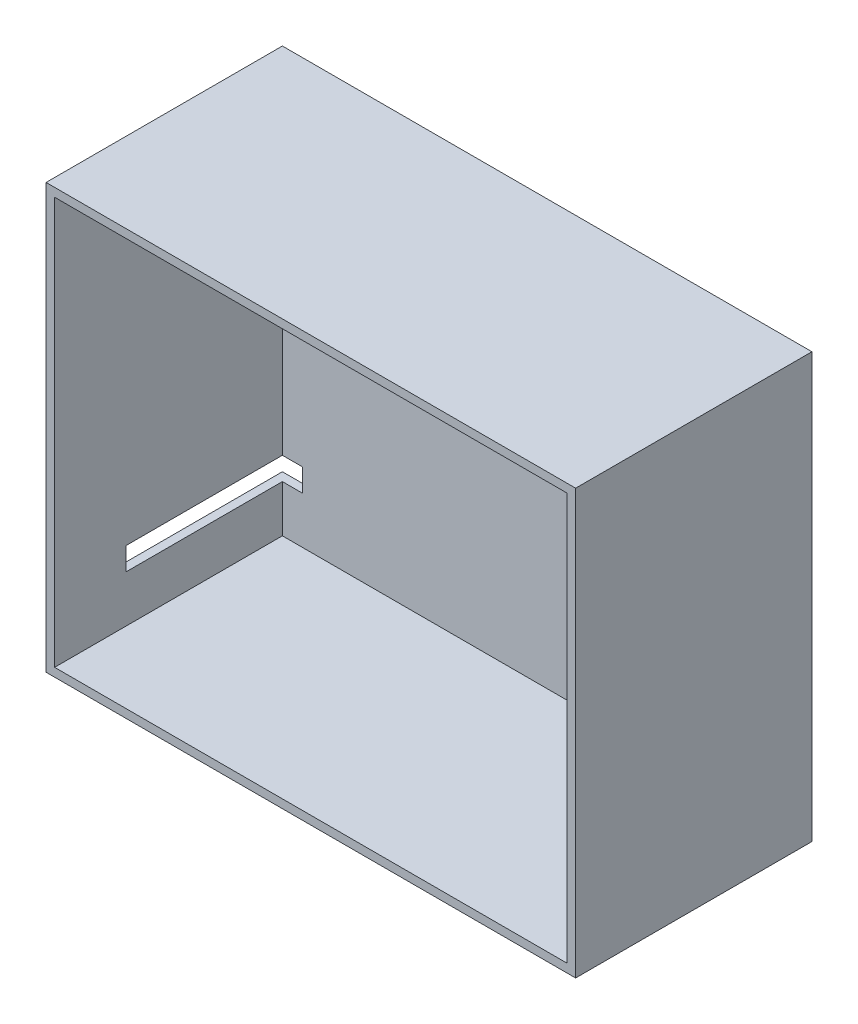
ISO-10303-21;
HEADER;
FILE_DESCRIPTION(('STEP AP214'),'2;1');
FILE_NAME('part.step','',(''),(''),'','','');
FILE_SCHEMA(('AUTOMOTIVE_DESIGN { 1 0 10303 214 1 1 1 1 }'));
ENDSEC;
DATA;
#1=APPLICATION_CONTEXT('core data for automotive mechanical design processes');
#2=APPLICATION_PROTOCOL_DEFINITION('international standard','automotive_design',2000,#1);
#3=PRODUCT_CONTEXT('',#1,'mechanical');
#4=PRODUCT('Part','Part','',(#3));
#5=PRODUCT_RELATED_PRODUCT_CATEGORY('part','',(#4));
#6=PRODUCT_DEFINITION_FORMATION('','',#4);
#7=PRODUCT_DEFINITION_CONTEXT('part definition',#1,'design');
#8=PRODUCT_DEFINITION('design','',#6,#7);
#9=PRODUCT_DEFINITION_SHAPE('','',#8);
#10=(LENGTH_UNIT() NAMED_UNIT(*) SI_UNIT(.MILLI.,.METRE.));
#11=(NAMED_UNIT(*) PLANE_ANGLE_UNIT() SI_UNIT($,.RADIAN.));
#12=(NAMED_UNIT(*) SI_UNIT($,.STERADIAN.) SOLID_ANGLE_UNIT());
#13=UNCERTAINTY_MEASURE_WITH_UNIT(LENGTH_MEASURE(1.E-05),#10,'distance_accuracy_value','');
#14=(GEOMETRIC_REPRESENTATION_CONTEXT(3) GLOBAL_UNCERTAINTY_ASSIGNED_CONTEXT((#13)) GLOBAL_UNIT_ASSIGNED_CONTEXT((#10,
#11,#12)) REPRESENTATION_CONTEXT('',''));
#15=CARTESIAN_POINT('',(0.,0.,0.));
#16=DIRECTION('',(0.,0.,1.));
#17=DIRECTION('',(1.,0.,0.));
#18=AXIS2_PLACEMENT_3D('',#15,#16,#17);
#19=CARTESIAN_POINT('',(0.,0.,3.));
#20=DIRECTION('',(1.,0.,0.));
#21=DIRECTION('',(0.,0.,-1.));
#22=AXIS2_PLACEMENT_3D('',#19,#20,#21);
#23=PLANE('',#22);
#24=DIRECTION('',(0.,0.,1.));
#25=VECTOR('',#24,1.);
#26=CARTESIAN_POINT('',(0.,19.5,3.));
#27=LINE('',#26,#25);
#28=CARTESIAN_POINT('',(0.,19.5,0.));
#29=VERTEX_POINT('',#28);
#30=CARTESIAN_POINT('',(0.,19.5,58.));
#31=VERTEX_POINT('',#30);
#32=EDGE_CURVE('E186',#29,#31,#27,.T.);
#33=ORIENTED_EDGE('',*,*,#32,.F.);
#34=DIRECTION('',(0.,-1.,0.));
#35=VECTOR('',#34,1.);
#36=CARTESIAN_POINT('',(0.,0.,0.));
#37=LINE('',#36,#35);
#38=CARTESIAN_POINT('',(0.,0.,0.));
#39=VERTEX_POINT('',#38);
#40=EDGE_CURVE('E163',#29,#39,#37,.T.);
#41=ORIENTED_EDGE('',*,*,#40,.T.);
#42=DIRECTION('',(0.,0.,-1.));
#43=VECTOR('',#42,1.);
#44=CARTESIAN_POINT('',(0.,0.,3.));
#45=LINE('',#44,#43);
#46=CARTESIAN_POINT('',(0.,0.,83.));
#47=VERTEX_POINT('',#46);
#48=EDGE_CURVE('E276',#47,#39,#45,.T.);
#49=ORIENTED_EDGE('',*,*,#48,.F.);
#50=DIRECTION('',(0.,-1.,0.));
#51=VECTOR('',#50,1.);
#52=CARTESIAN_POINT('',(0.,0.,83.));
#53=LINE('',#52,#51);
#54=CARTESIAN_POINT('',(0.,149.,83.));
#55=VERTEX_POINT('',#54);
#56=EDGE_CURVE('E225',#55,#47,#53,.T.);
#57=ORIENTED_EDGE('',*,*,#56,.F.);
#58=DIRECTION('',(0.,0.,-1.));
#59=VECTOR('',#58,1.);
#60=CARTESIAN_POINT('',(0.,149.,3.));
#61=LINE('',#60,#59);
#62=CARTESIAN_POINT('',(0.,149.,0.));
#63=VERTEX_POINT('',#62);
#64=EDGE_CURVE('E270',#55,#63,#61,.T.);
#65=ORIENTED_EDGE('',*,*,#64,.T.);
#66=CARTESIAN_POINT('',(0.,27.5,0.));
#67=VERTEX_POINT('',#66);
#68=EDGE_CURVE('E255',#63,#67,#37,.T.);
#69=ORIENTED_EDGE('',*,*,#68,.T.);
#70=DIRECTION('',(0.,0.,-1.));
#71=VECTOR('',#70,1.);
#72=CARTESIAN_POINT('',(0.,27.5,3.));
#73=LINE('',#72,#71);
#74=CARTESIAN_POINT('',(0.,27.5,58.));
#75=VERTEX_POINT('',#74);
#76=EDGE_CURVE('E182',#75,#67,#73,.T.);
#77=ORIENTED_EDGE('',*,*,#76,.F.);
#78=DIRECTION('',(0.,1.,0.));
#79=VECTOR('',#78,1.);
#80=CARTESIAN_POINT('',(0.,0.,58.));
#81=LINE('',#80,#79);
#82=EDGE_CURVE('E192',#31,#75,#81,.T.);
#83=ORIENTED_EDGE('',*,*,#82,.F.);
#84=EDGE_LOOP('',(#33,#41,#49,#57,#65,#69,#77,#83));
#85=FACE_BOUND('',#84,.T.);
#86=ADVANCED_FACE('F44',(#85),#23,.F.);
#87=CARTESIAN_POINT('',(0.,0.,0.));
#88=DIRECTION('',(0.,0.,-1.));
#89=DIRECTION('',(-1.,0.,0.));
#90=AXIS2_PLACEMENT_3D('',#87,#88,#89);
#91=PLANE('',#90);
#92=DIRECTION('',(0.,1.,0.));
#93=VECTOR('',#92,1.);
#94=CARTESIAN_POINT('',(10.,19.5,0.));
#95=LINE('',#94,#93);
#96=CARTESIAN_POINT('',(10.,19.5,0.));
#97=VERTEX_POINT('',#96);
#98=CARTESIAN_POINT('',(10.,27.5,0.));
#99=VERTEX_POINT('',#98);
#100=EDGE_CURVE('E156',#97,#99,#95,.T.);
#101=ORIENTED_EDGE('',*,*,#100,.T.);
#102=DIRECTION('',(-1.,0.,0.));
#103=VECTOR('',#102,1.);
#104=CARTESIAN_POINT('',(-1.,27.5,0.));
#105=LINE('',#104,#103);
#106=EDGE_CURVE('E58',#99,#67,#105,.T.);
#107=ORIENTED_EDGE('',*,*,#106,.T.);
#108=ORIENTED_EDGE('',*,*,#68,.F.);
#109=DIRECTION('',(-1.,0.,0.));
#110=VECTOR('',#109,1.);
#111=CARTESIAN_POINT('',(0.,149.,0.));
#112=LINE('',#111,#110);
#113=CARTESIAN_POINT('',(186.,149.,0.));
#114=VERTEX_POINT('',#113);
#115=EDGE_CURVE('E262',#114,#63,#112,.T.);
#116=ORIENTED_EDGE('',*,*,#115,.F.);
#117=DIRECTION('',(0.,1.,0.));
#118=VECTOR('',#117,1.);
#119=CARTESIAN_POINT('',(186.,0.,0.));
#120=LINE('',#119,#118);
#121=CARTESIAN_POINT('',(186.,0.,0.));
#122=VERTEX_POINT('',#121);
#123=EDGE_CURVE('E261',#122,#114,#120,.T.);
#124=ORIENTED_EDGE('',*,*,#123,.F.);
#125=DIRECTION('',(1.,0.,0.));
#126=VECTOR('',#125,1.);
#127=CARTESIAN_POINT('',(0.,0.,0.));
#128=LINE('',#127,#126);
#129=EDGE_CURVE('E256',#39,#122,#128,.T.);
#130=ORIENTED_EDGE('',*,*,#129,.F.);
#131=ORIENTED_EDGE('',*,*,#40,.F.);
#132=DIRECTION('',(1.,0.,0.));
#133=VECTOR('',#132,1.);
#134=CARTESIAN_POINT('',(-1.,19.5,0.));
#135=LINE('',#134,#133);
#136=EDGE_CURVE('E150',#29,#97,#135,.T.);
#137=ORIENTED_EDGE('',*,*,#136,.T.);
#138=EDGE_LOOP('',(#101,#107,#108,#116,#124,#130,#131,#137));
#139=FACE_BOUND('',#138,.T.);
#140=ADVANCED_FACE('F165',(#139),#91,.T.);
#141=CARTESIAN_POINT('',(3.,3.,83.));
#142=DIRECTION('',(1.,0.,0.));
#143=DIRECTION('',(0.,0.,-1.));
#144=AXIS2_PLACEMENT_3D('',#141,#142,#143);
#145=PLANE('',#144);
#146=DIRECTION('',(0.,-1.,0.));
#147=VECTOR('',#146,1.);
#148=CARTESIAN_POINT('',(3.,0.,3.));
#149=LINE('',#148,#147);
#150=CARTESIAN_POINT('',(3.,19.5,3.));
#151=VERTEX_POINT('',#150);
#152=CARTESIAN_POINT('',(3.,3.,3.));
#153=VERTEX_POINT('',#152);
#154=EDGE_CURVE('E248',#151,#153,#149,.T.);
#155=ORIENTED_EDGE('',*,*,#154,.F.);
#156=DIRECTION('',(0.,0.,1.));
#157=VECTOR('',#156,1.);
#158=CARTESIAN_POINT('',(3.,19.5,83.));
#159=LINE('',#158,#157);
#160=CARTESIAN_POINT('',(3.,19.5,58.));
#161=VERTEX_POINT('',#160);
#162=EDGE_CURVE('E184',#151,#161,#159,.T.);
#163=ORIENTED_EDGE('',*,*,#162,.T.);
#164=DIRECTION('',(0.,1.,0.));
#165=VECTOR('',#164,1.);
#166=CARTESIAN_POINT('',(3.,3.,58.));
#167=LINE('',#166,#165);
#168=CARTESIAN_POINT('',(3.,27.5,58.));
#169=VERTEX_POINT('',#168);
#170=EDGE_CURVE('E11',#161,#169,#167,.T.);
#171=ORIENTED_EDGE('',*,*,#170,.T.);
#172=DIRECTION('',(0.,0.,-1.));
#173=VECTOR('',#172,1.);
#174=CARTESIAN_POINT('',(3.,27.5,83.));
#175=LINE('',#174,#173);
#176=CARTESIAN_POINT('',(3.,27.5,3.));
#177=VERTEX_POINT('',#176);
#178=EDGE_CURVE('E153',#169,#177,#175,.T.);
#179=ORIENTED_EDGE('',*,*,#178,.T.);
#180=CARTESIAN_POINT('',(3.,146.,3.));
#181=VERTEX_POINT('',#180);
#182=EDGE_CURVE('E253',#181,#177,#149,.T.);
#183=ORIENTED_EDGE('',*,*,#182,.F.);
#184=DIRECTION('',(0.,0.,-1.));
#185=VECTOR('',#184,1.);
#186=CARTESIAN_POINT('',(3.,146.,83.));
#187=LINE('',#186,#185);
#188=CARTESIAN_POINT('',(3.,146.,83.));
#189=VERTEX_POINT('',#188);
#190=EDGE_CURVE('E210',#189,#181,#187,.T.);
#191=ORIENTED_EDGE('',*,*,#190,.F.);
#192=DIRECTION('',(0.,-1.,0.));
#193=VECTOR('',#192,1.);
#194=CARTESIAN_POINT('',(3.,3.,83.));
#195=LINE('',#194,#193);
#196=CARTESIAN_POINT('',(3.,3.,83.));
#197=VERTEX_POINT('',#196);
#198=EDGE_CURVE('E191',#189,#197,#195,.T.);
#199=ORIENTED_EDGE('',*,*,#198,.T.);
#200=DIRECTION('',(0.,0.,-1.));
#201=VECTOR('',#200,1.);
#202=CARTESIAN_POINT('',(3.,3.,83.));
#203=LINE('',#202,#201);
#204=EDGE_CURVE('E217',#197,#153,#203,.T.);
#205=ORIENTED_EDGE('',*,*,#204,.T.);
#206=EDGE_LOOP('',(#155,#163,#171,#179,#183,#191,#199,#205));
#207=FACE_BOUND('',#206,.T.);
#208=ADVANCED_FACE('F304',(#207),#145,.T.);
#209=CARTESIAN_POINT('',(0.,0.,3.));
#210=DIRECTION('',(0.,0.,-1.));
#211=DIRECTION('',(-1.,0.,0.));
#212=AXIS2_PLACEMENT_3D('',#209,#210,#211);
#213=PLANE('',#212);
#214=DIRECTION('',(1.,0.,0.));
#215=VECTOR('',#214,1.);
#216=CARTESIAN_POINT('',(0.,19.5,3.));
#217=LINE('',#216,#215);
#218=CARTESIAN_POINT('',(10.,19.5,3.00000000000002));
#219=VERTEX_POINT('',#218);
#220=EDGE_CURVE('E52',#151,#219,#217,.T.);
#221=ORIENTED_EDGE('',*,*,#220,.F.);
#222=ORIENTED_EDGE('',*,*,#154,.T.);
#223=DIRECTION('',(1.,0.,0.));
#224=VECTOR('',#223,1.);
#225=CARTESIAN_POINT('',(0.,3.,3.));
#226=LINE('',#225,#224);
#227=CARTESIAN_POINT('',(183.,3.,3.));
#228=VERTEX_POINT('',#227);
#229=EDGE_CURVE('E247',#153,#228,#226,.T.);
#230=ORIENTED_EDGE('',*,*,#229,.T.);
#231=DIRECTION('',(0.,1.,0.));
#232=VECTOR('',#231,1.);
#233=CARTESIAN_POINT('',(183.,0.,3.));
#234=LINE('',#233,#232);
#235=CARTESIAN_POINT('',(183.,146.,3.));
#236=VERTEX_POINT('',#235);
#237=EDGE_CURVE('E245',#228,#236,#234,.T.);
#238=ORIENTED_EDGE('',*,*,#237,.T.);
#239=DIRECTION('',(-1.,0.,0.));
#240=VECTOR('',#239,1.);
#241=CARTESIAN_POINT('',(0.,146.,3.));
#242=LINE('',#241,#240);
#243=EDGE_CURVE('E236',#236,#181,#242,.T.);
#244=ORIENTED_EDGE('',*,*,#243,.T.);
#245=ORIENTED_EDGE('',*,*,#182,.T.);
#246=DIRECTION('',(-1.,0.,0.));
#247=VECTOR('',#246,1.);
#248=CARTESIAN_POINT('',(0.,27.5,3.));
#249=LINE('',#248,#247);
#250=CARTESIAN_POINT('',(10.,27.5,3.));
#251=VERTEX_POINT('',#250);
#252=EDGE_CURVE('E281',#251,#177,#249,.T.);
#253=ORIENTED_EDGE('',*,*,#252,.F.);
#254=DIRECTION('',(0.,1.,0.));
#255=VECTOR('',#254,1.);
#256=CARTESIAN_POINT('',(10.,0.,3.));
#257=LINE('',#256,#255);
#258=EDGE_CURVE('E287',#219,#251,#257,.T.);
#259=ORIENTED_EDGE('',*,*,#258,.F.);
#260=EDGE_LOOP('',(#221,#222,#230,#238,#244,#245,#253,#259));
#261=FACE_BOUND('',#260,.T.);
#262=ADVANCED_FACE('F293',(#261),#213,.F.);
#263=CARTESIAN_POINT('',(0.,0.,3.));
#264=DIRECTION('',(0.,1.,0.));
#265=DIRECTION('',(0.,0.,1.));
#266=AXIS2_PLACEMENT_3D('',#263,#264,#265);
#267=PLANE('',#266);
#268=ORIENTED_EDGE('',*,*,#129,.T.);
#269=DIRECTION('',(0.,0.,-1.));
#270=VECTOR('',#269,1.);
#271=CARTESIAN_POINT('',(186.,0.,3.));
#272=LINE('',#271,#270);
#273=CARTESIAN_POINT('',(186.,0.,83.));
#274=VERTEX_POINT('',#273);
#275=EDGE_CURVE('E274',#274,#122,#272,.T.);
#276=ORIENTED_EDGE('',*,*,#275,.F.);
#277=DIRECTION('',(1.,0.,0.));
#278=VECTOR('',#277,1.);
#279=CARTESIAN_POINT('',(0.,0.,83.));
#280=LINE('',#279,#278);
#281=EDGE_CURVE('E228',#47,#274,#280,.T.);
#282=ORIENTED_EDGE('',*,*,#281,.F.);
#283=ORIENTED_EDGE('',*,*,#48,.T.);
#284=EDGE_LOOP('',(#268,#276,#282,#283));
#285=FACE_BOUND('',#284,.T.);
#286=ADVANCED_FACE('F329',(#285),#267,.F.);
#287=CARTESIAN_POINT('',(186.,0.,3.));
#288=DIRECTION('',(-1.,0.,0.));
#289=DIRECTION('',(0.,0.,1.));
#290=AXIS2_PLACEMENT_3D('',#287,#288,#289);
#291=PLANE('',#290);
#292=ORIENTED_EDGE('',*,*,#123,.T.);
#293=DIRECTION('',(0.,0.,-1.));
#294=VECTOR('',#293,1.);
#295=CARTESIAN_POINT('',(186.,149.,3.));
#296=LINE('',#295,#294);
#297=CARTESIAN_POINT('',(186.,149.,83.));
#298=VERTEX_POINT('',#297);
#299=EDGE_CURVE('E271',#298,#114,#296,.T.);
#300=ORIENTED_EDGE('',*,*,#299,.F.);
#301=DIRECTION('',(0.,1.,0.));
#302=VECTOR('',#301,1.);
#303=CARTESIAN_POINT('',(186.,0.,83.));
#304=LINE('',#303,#302);
#305=EDGE_CURVE('E227',#274,#298,#304,.T.);
#306=ORIENTED_EDGE('',*,*,#305,.F.);
#307=ORIENTED_EDGE('',*,*,#275,.T.);
#308=EDGE_LOOP('',(#292,#300,#306,#307));
#309=FACE_BOUND('',#308,.T.);
#310=ADVANCED_FACE('F336',(#309),#291,.F.);
#311=CARTESIAN_POINT('',(0.,149.,3.));
#312=DIRECTION('',(0.,-1.,0.));
#313=DIRECTION('',(0.,0.,-1.));
#314=AXIS2_PLACEMENT_3D('',#311,#312,#313);
#315=PLANE('',#314);
#316=ORIENTED_EDGE('',*,*,#115,.T.);
#317=ORIENTED_EDGE('',*,*,#64,.F.);
#318=DIRECTION('',(-1.,0.,0.));
#319=VECTOR('',#318,1.);
#320=CARTESIAN_POINT('',(0.,149.,83.));
#321=LINE('',#320,#319);
#322=EDGE_CURVE('E231',#298,#55,#321,.T.);
#323=ORIENTED_EDGE('',*,*,#322,.F.);
#324=ORIENTED_EDGE('',*,*,#299,.T.);
#325=EDGE_LOOP('',(#316,#317,#323,#324));
#326=FACE_BOUND('',#325,.T.);
#327=ADVANCED_FACE('F338',(#326),#315,.F.);
#328=CARTESIAN_POINT('',(3.,3.,83.));
#329=DIRECTION('',(0.,1.,0.));
#330=DIRECTION('',(0.,0.,1.));
#331=AXIS2_PLACEMENT_3D('',#328,#329,#330);
#332=PLANE('',#331);
#333=ORIENTED_EDGE('',*,*,#229,.F.);
#334=ORIENTED_EDGE('',*,*,#204,.F.);
#335=DIRECTION('',(1.,0.,0.));
#336=VECTOR('',#335,1.);
#337=CARTESIAN_POINT('',(3.,3.,83.));
#338=LINE('',#337,#336);
#339=CARTESIAN_POINT('',(183.,3.,83.));
#340=VERTEX_POINT('',#339);
#341=EDGE_CURVE('E197',#197,#340,#338,.T.);
#342=ORIENTED_EDGE('',*,*,#341,.T.);
#343=DIRECTION('',(0.,0.,-1.));
#344=VECTOR('',#343,1.);
#345=CARTESIAN_POINT('',(183.,3.,83.));
#346=LINE('',#345,#344);
#347=EDGE_CURVE('E212',#340,#228,#346,.T.);
#348=ORIENTED_EDGE('',*,*,#347,.T.);
#349=EDGE_LOOP('',(#333,#334,#342,#348));
#350=FACE_BOUND('',#349,.T.);
#351=ADVANCED_FACE('F299',(#350),#332,.T.);
#352=CARTESIAN_POINT('',(183.,3.,83.));
#353=DIRECTION('',(-1.,0.,0.));
#354=DIRECTION('',(0.,0.,1.));
#355=AXIS2_PLACEMENT_3D('',#352,#353,#354);
#356=PLANE('',#355);
#357=ORIENTED_EDGE('',*,*,#237,.F.);
#358=ORIENTED_EDGE('',*,*,#347,.F.);
#359=DIRECTION('',(0.,1.,0.));
#360=VECTOR('',#359,1.);
#361=CARTESIAN_POINT('',(183.,3.,83.));
#362=LINE('',#361,#360);
#363=CARTESIAN_POINT('',(183.,146.,83.));
#364=VERTEX_POINT('',#363);
#365=EDGE_CURVE('E199',#340,#364,#362,.T.);
#366=ORIENTED_EDGE('',*,*,#365,.T.);
#367=DIRECTION('',(0.,0.,-1.));
#368=VECTOR('',#367,1.);
#369=CARTESIAN_POINT('',(183.,146.,83.));
#370=LINE('',#369,#368);
#371=EDGE_CURVE('E209',#364,#236,#370,.T.);
#372=ORIENTED_EDGE('',*,*,#371,.T.);
#373=EDGE_LOOP('',(#357,#358,#366,#372));
#374=FACE_BOUND('',#373,.T.);
#375=ADVANCED_FACE('F313',(#374),#356,.T.);
#376=CARTESIAN_POINT('',(3.,146.,83.));
#377=DIRECTION('',(0.,-1.,0.));
#378=DIRECTION('',(0.,0.,-1.));
#379=AXIS2_PLACEMENT_3D('',#376,#377,#378);
#380=PLANE('',#379);
#381=ORIENTED_EDGE('',*,*,#243,.F.);
#382=ORIENTED_EDGE('',*,*,#371,.F.);
#383=DIRECTION('',(-1.,0.,0.));
#384=VECTOR('',#383,1.);
#385=CARTESIAN_POINT('',(3.,146.,83.));
#386=LINE('',#385,#384);
#387=EDGE_CURVE('E204',#364,#189,#386,.T.);
#388=ORIENTED_EDGE('',*,*,#387,.T.);
#389=ORIENTED_EDGE('',*,*,#190,.T.);
#390=EDGE_LOOP('',(#381,#382,#388,#389));
#391=FACE_BOUND('',#390,.T.);
#392=ADVANCED_FACE('F314',(#391),#380,.T.);
#393=CARTESIAN_POINT('',(0.,0.,83.));
#394=DIRECTION('',(0.,0.,-1.));
#395=DIRECTION('',(-1.,0.,0.));
#396=AXIS2_PLACEMENT_3D('',#393,#394,#395);
#397=PLANE('',#396);
#398=ORIENTED_EDGE('',*,*,#56,.T.);
#399=ORIENTED_EDGE('',*,*,#281,.T.);
#400=ORIENTED_EDGE('',*,*,#305,.T.);
#401=ORIENTED_EDGE('',*,*,#322,.T.);
#402=EDGE_LOOP('',(#398,#399,#400,#401));
#403=FACE_BOUND('',#402,.T.);
#404=ORIENTED_EDGE('',*,*,#198,.F.);
#405=ORIENTED_EDGE('',*,*,#387,.F.);
#406=ORIENTED_EDGE('',*,*,#365,.F.);
#407=ORIENTED_EDGE('',*,*,#341,.F.);
#408=EDGE_LOOP('',(#404,#405,#406,#407));
#409=FACE_BOUND('',#408,.T.);
#410=ADVANCED_FACE('F306',(#403,#409),#397,.F.);
#411=CARTESIAN_POINT('',(0.,0.,58.));
#412=DIRECTION('',(0.,0.,-1.));
#413=DIRECTION('',(-1.,0.,0.));
#414=AXIS2_PLACEMENT_3D('',#411,#412,#413);
#415=PLANE('',#414);
#416=ORIENTED_EDGE('',*,*,#82,.T.);
#417=DIRECTION('',(-1.,0.,0.));
#418=VECTOR('',#417,1.);
#419=CARTESIAN_POINT('',(-1.,27.5,58.));
#420=LINE('',#419,#418);
#421=EDGE_CURVE('E168',#169,#75,#420,.T.);
#422=ORIENTED_EDGE('',*,*,#421,.F.);
#423=ORIENTED_EDGE('',*,*,#170,.F.);
#424=DIRECTION('',(1.,0.,0.));
#425=VECTOR('',#424,1.);
#426=CARTESIAN_POINT('',(-1.,19.5,58.));
#427=LINE('',#426,#425);
#428=EDGE_CURVE('E172',#31,#161,#427,.T.);
#429=ORIENTED_EDGE('',*,*,#428,.F.);
#430=EDGE_LOOP('',(#416,#422,#423,#429));
#431=FACE_BOUND('',#430,.T.);
#432=ADVANCED_FACE('F319',(#431),#415,.T.);
#433=CARTESIAN_POINT('',(-1.,19.5,58.));
#434=DIRECTION('',(0.,1.,0.));
#435=DIRECTION('',(0.,0.,1.));
#436=AXIS2_PLACEMENT_3D('',#433,#434,#435);
#437=PLANE('',#436);
#438=ORIENTED_EDGE('',*,*,#32,.T.);
#439=ORIENTED_EDGE('',*,*,#428,.T.);
#440=ORIENTED_EDGE('',*,*,#162,.F.);
#441=ORIENTED_EDGE('',*,*,#220,.T.);
#442=DIRECTION('',(0.,0.,-1.));
#443=VECTOR('',#442,1.);
#444=CARTESIAN_POINT('',(10.,19.5,58.));
#445=LINE('',#444,#443);
#446=EDGE_CURVE('E141',#219,#97,#445,.T.);
#447=ORIENTED_EDGE('',*,*,#446,.T.);
#448=ORIENTED_EDGE('',*,*,#136,.F.);
#449=EDGE_LOOP('',(#438,#439,#440,#441,#447,#448));
#450=FACE_BOUND('',#449,.T.);
#451=ADVANCED_FACE('F144',(#450),#437,.T.);
#452=CARTESIAN_POINT('',(10.,19.5,58.));
#453=DIRECTION('',(-1.,0.,0.));
#454=DIRECTION('',(0.,0.,1.));
#455=AXIS2_PLACEMENT_3D('',#452,#453,#454);
#456=PLANE('',#455);
#457=ORIENTED_EDGE('',*,*,#258,.T.);
#458=DIRECTION('',(0.,0.,-1.));
#459=VECTOR('',#458,1.);
#460=CARTESIAN_POINT('',(10.,27.5,58.));
#461=LINE('',#460,#459);
#462=EDGE_CURVE('E64',#251,#99,#461,.T.);
#463=ORIENTED_EDGE('',*,*,#462,.T.);
#464=ORIENTED_EDGE('',*,*,#100,.F.);
#465=ORIENTED_EDGE('',*,*,#446,.F.);
#466=EDGE_LOOP('',(#457,#463,#464,#465));
#467=FACE_BOUND('',#466,.T.);
#468=ADVANCED_FACE('F160',(#467),#456,.T.);
#469=CARTESIAN_POINT('',(-1.,27.5,58.));
#470=DIRECTION('',(0.,-1.,0.));
#471=DIRECTION('',(0.,0.,-1.));
#472=AXIS2_PLACEMENT_3D('',#469,#470,#471);
#473=PLANE('',#472);
#474=ORIENTED_EDGE('',*,*,#76,.T.);
#475=ORIENTED_EDGE('',*,*,#106,.F.);
#476=ORIENTED_EDGE('',*,*,#462,.F.);
#477=ORIENTED_EDGE('',*,*,#252,.T.);
#478=ORIENTED_EDGE('',*,*,#178,.F.);
#479=ORIENTED_EDGE('',*,*,#421,.T.);
#480=EDGE_LOOP('',(#474,#475,#476,#477,#478,#479));
#481=FACE_BOUND('',#480,.T.);
#482=ADVANCED_FACE('F320',(#481),#473,.T.);
#483=CLOSED_SHELL('',(#86,#140,#208,#262,#286,#310,#327,#351,#375,#392,#410,#432,#451,#468,#482));
#484=MANIFOLD_SOLID_BREP('B2',#483);
#485=ADVANCED_BREP_SHAPE_REPRESENTATION('',(#18,#484),#14);
#486=SHAPE_DEFINITION_REPRESENTATION(#9,#485);
ENDSEC;
END-ISO-10303-21;
